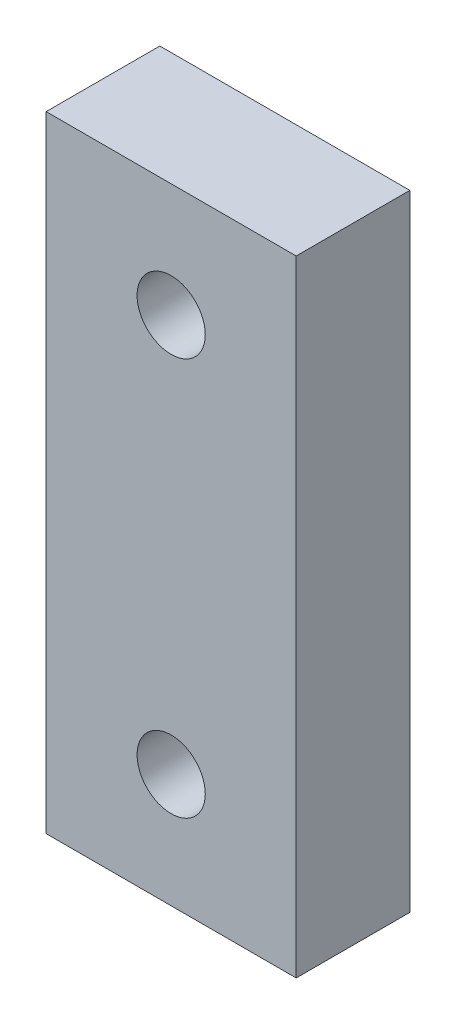
ISO-10303-21;
HEADER;
FILE_DESCRIPTION(('STEP AP214'),'2;1');
FILE_NAME('part.step','',(''),(''),'','','');
FILE_SCHEMA(('AUTOMOTIVE_DESIGN { 1 0 10303 214 1 1 1 1 }'));
ENDSEC;
DATA;
#1=APPLICATION_CONTEXT('core data for automotive mechanical design processes');
#2=APPLICATION_PROTOCOL_DEFINITION('international standard','automotive_design',2000,#1);
#3=PRODUCT_CONTEXT('',#1,'mechanical');
#4=PRODUCT('Part','Part','',(#3));
#5=PRODUCT_RELATED_PRODUCT_CATEGORY('part','',(#4));
#6=PRODUCT_DEFINITION_FORMATION('','',#4);
#7=PRODUCT_DEFINITION_CONTEXT('part definition',#1,'design');
#8=PRODUCT_DEFINITION('design','',#6,#7);
#9=PRODUCT_DEFINITION_SHAPE('','',#8);
#10=(LENGTH_UNIT() NAMED_UNIT(*) SI_UNIT(.MILLI.,.METRE.));
#11=(NAMED_UNIT(*) PLANE_ANGLE_UNIT() SI_UNIT($,.RADIAN.));
#12=(NAMED_UNIT(*) SI_UNIT($,.STERADIAN.) SOLID_ANGLE_UNIT());
#13=UNCERTAINTY_MEASURE_WITH_UNIT(LENGTH_MEASURE(1.E-05),#10,'distance_accuracy_value','');
#14=(GEOMETRIC_REPRESENTATION_CONTEXT(3) GLOBAL_UNCERTAINTY_ASSIGNED_CONTEXT((#13)) GLOBAL_UNIT_ASSIGNED_CONTEXT((#10,
#11,#12)) REPRESENTATION_CONTEXT('',''));
#15=CARTESIAN_POINT('',(0.,0.,0.));
#16=DIRECTION('',(0.,0.,1.));
#17=DIRECTION('',(1.,0.,0.));
#18=AXIS2_PLACEMENT_3D('',#15,#16,#17);
#19=CARTESIAN_POINT('',(5.5,13.755,5.));
#20=DIRECTION('',(-1.,0.,0.));
#21=DIRECTION('',(0.,-1.,0.));
#22=AXIS2_PLACEMENT_3D('',#19,#20,#21);
#23=PLANE('',#22);
#24=DIRECTION('',(0.,1.,0.));
#25=VECTOR('',#24,1.);
#26=CARTESIAN_POINT('',(5.5,13.755,0.));
#27=LINE('',#26,#25);
#28=CARTESIAN_POINT('',(5.5,-13.755,0.));
#29=VERTEX_POINT('',#28);
#30=CARTESIAN_POINT('',(5.5,13.755,0.));
#31=VERTEX_POINT('',#30);
#32=EDGE_CURVE('E100',#29,#31,#27,.T.);
#33=ORIENTED_EDGE('',*,*,#32,.T.);
#34=DIRECTION('',(0.,0.,-1.));
#35=VECTOR('',#34,1.);
#36=CARTESIAN_POINT('',(5.5,13.755,5.));
#37=LINE('',#36,#35);
#38=CARTESIAN_POINT('',(5.5,13.755,5.));
#39=VERTEX_POINT('',#38);
#40=EDGE_CURVE('E11',#39,#31,#37,.T.);
#41=ORIENTED_EDGE('',*,*,#40,.F.);
#42=DIRECTION('',(0.,1.,0.));
#43=VECTOR('',#42,1.);
#44=CARTESIAN_POINT('',(5.5,13.755,5.));
#45=LINE('',#44,#43);
#46=CARTESIAN_POINT('',(5.5,-13.755,5.));
#47=VERTEX_POINT('',#46);
#48=EDGE_CURVE('E88',#47,#39,#45,.T.);
#49=ORIENTED_EDGE('',*,*,#48,.F.);
#50=DIRECTION('',(0.,0.,-1.));
#51=VECTOR('',#50,1.);
#52=CARTESIAN_POINT('',(5.5,-13.755,5.));
#53=LINE('',#52,#51);
#54=EDGE_CURVE('E96',#47,#29,#53,.T.);
#55=ORIENTED_EDGE('',*,*,#54,.T.);
#56=EDGE_LOOP('',(#33,#41,#49,#55));
#57=FACE_BOUND('',#56,.T.);
#58=ADVANCED_FACE('F37',(#57),#23,.F.);
#59=CARTESIAN_POINT('',(-5.5,13.755,5.));
#60=DIRECTION('',(0.,-1.,0.));
#61=DIRECTION('',(0.,0.,-1.));
#62=AXIS2_PLACEMENT_3D('',#59,#60,#61);
#63=PLANE('',#62);
#64=DIRECTION('',(-1.,0.,0.));
#65=VECTOR('',#64,1.);
#66=CARTESIAN_POINT('',(-5.5,13.755,0.));
#67=LINE('',#66,#65);
#68=CARTESIAN_POINT('',(-5.5,13.755,0.));
#69=VERTEX_POINT('',#68);
#70=EDGE_CURVE('E92',#31,#69,#67,.T.);
#71=ORIENTED_EDGE('',*,*,#70,.T.);
#72=DIRECTION('',(0.,0.,-1.));
#73=VECTOR('',#72,1.);
#74=CARTESIAN_POINT('',(-5.5,13.755,5.));
#75=LINE('',#74,#73);
#76=CARTESIAN_POINT('',(-5.5,13.755,5.));
#77=VERTEX_POINT('',#76);
#78=EDGE_CURVE('E45',#77,#69,#75,.T.);
#79=ORIENTED_EDGE('',*,*,#78,.F.);
#80=DIRECTION('',(-1.,0.,0.));
#81=VECTOR('',#80,1.);
#82=CARTESIAN_POINT('',(-5.5,13.755,5.));
#83=LINE('',#82,#81);
#84=EDGE_CURVE('E83',#39,#77,#83,.T.);
#85=ORIENTED_EDGE('',*,*,#84,.F.);
#86=ORIENTED_EDGE('',*,*,#40,.T.);
#87=EDGE_LOOP('',(#71,#79,#85,#86));
#88=FACE_BOUND('',#87,.T.);
#89=ADVANCED_FACE('F91',(#88),#63,.F.);
#90=CARTESIAN_POINT('',(-5.5,13.755,5.));
#91=DIRECTION('',(1.,0.,0.));
#92=DIRECTION('',(0.,1.,0.));
#93=AXIS2_PLACEMENT_3D('',#90,#91,#92);
#94=PLANE('',#93);
#95=DIRECTION('',(0.,-1.,0.));
#96=VECTOR('',#95,1.);
#97=CARTESIAN_POINT('',(-5.5,13.755,0.));
#98=LINE('',#97,#96);
#99=CARTESIAN_POINT('',(-5.5,-13.755,0.));
#100=VERTEX_POINT('',#99);
#101=EDGE_CURVE('E70',#69,#100,#98,.T.);
#102=ORIENTED_EDGE('',*,*,#101,.T.);
#103=DIRECTION('',(0.,0.,-1.));
#104=VECTOR('',#103,1.);
#105=CARTESIAN_POINT('',(-5.5,-13.755,5.));
#106=LINE('',#105,#104);
#107=CARTESIAN_POINT('',(-5.5,-13.755,5.));
#108=VERTEX_POINT('',#107);
#109=EDGE_CURVE('E93',#108,#100,#106,.T.);
#110=ORIENTED_EDGE('',*,*,#109,.F.);
#111=DIRECTION('',(0.,-1.,0.));
#112=VECTOR('',#111,1.);
#113=CARTESIAN_POINT('',(-5.5,13.755,5.));
#114=LINE('',#113,#112);
#115=EDGE_CURVE('E86',#77,#108,#114,.T.);
#116=ORIENTED_EDGE('',*,*,#115,.F.);
#117=ORIENTED_EDGE('',*,*,#78,.T.);
#118=EDGE_LOOP('',(#102,#110,#116,#117));
#119=FACE_BOUND('',#118,.T.);
#120=ADVANCED_FACE('F94',(#119),#94,.F.);
#121=CARTESIAN_POINT('',(-5.5,-13.755,5.));
#122=DIRECTION('',(0.,1.,0.));
#123=DIRECTION('',(0.,0.,1.));
#124=AXIS2_PLACEMENT_3D('',#121,#122,#123);
#125=PLANE('',#124);
#126=DIRECTION('',(1.,0.,0.));
#127=VECTOR('',#126,1.);
#128=CARTESIAN_POINT('',(-5.5,-13.755,0.));
#129=LINE('',#128,#127);
#130=EDGE_CURVE('E76',#100,#29,#129,.T.);
#131=ORIENTED_EDGE('',*,*,#130,.T.);
#132=ORIENTED_EDGE('',*,*,#54,.F.);
#133=DIRECTION('',(1.,0.,0.));
#134=VECTOR('',#133,1.);
#135=CARTESIAN_POINT('',(-5.5,-13.755,5.));
#136=LINE('',#135,#134);
#137=EDGE_CURVE('E53',#108,#47,#136,.T.);
#138=ORIENTED_EDGE('',*,*,#137,.F.);
#139=ORIENTED_EDGE('',*,*,#109,.T.);
#140=EDGE_LOOP('',(#131,#132,#138,#139));
#141=FACE_BOUND('',#140,.T.);
#142=ADVANCED_FACE('F108',(#141),#125,.F.);
#143=CARTESIAN_POINT('',(0.,0.,5.));
#144=DIRECTION('',(0.,0.,1.));
#145=DIRECTION('',(1.,0.,0.));
#146=AXIS2_PLACEMENT_3D('',#143,#144,#145);
#147=PLANE('',#146);
#148=CARTESIAN_POINT('',(0.,8.755,5.));
#149=DIRECTION('',(0.,0.,1.));
#150=DIRECTION('',(1.,0.,0.));
#151=AXIS2_PLACEMENT_3D('',#148,#149,#150);
#152=CIRCLE('',#151,1.5);
#153=CARTESIAN_POINT('',(1.5,8.755,5.));
#154=VERTEX_POINT('',#153);
#155=EDGE_CURVE('E120',#154,#154,#152,.T.);
#156=ORIENTED_EDGE('',*,*,#155,.F.);
#157=EDGE_LOOP('',(#156));
#158=FACE_BOUND('',#157,.T.);
#159=CARTESIAN_POINT('',(0.,-8.745,5.));
#160=DIRECTION('',(0.,0.,1.));
#161=DIRECTION('',(1.,0.,0.));
#162=AXIS2_PLACEMENT_3D('',#159,#160,#161);
#163=CIRCLE('',#162,1.5);
#164=CARTESIAN_POINT('',(1.5,-8.745,5.));
#165=VERTEX_POINT('',#164);
#166=EDGE_CURVE('E114',#165,#165,#163,.T.);
#167=ORIENTED_EDGE('',*,*,#166,.F.);
#168=EDGE_LOOP('',(#167));
#169=FACE_BOUND('',#168,.T.);
#170=ORIENTED_EDGE('',*,*,#48,.T.);
#171=ORIENTED_EDGE('',*,*,#84,.T.);
#172=ORIENTED_EDGE('',*,*,#115,.T.);
#173=ORIENTED_EDGE('',*,*,#137,.T.);
#174=EDGE_LOOP('',(#170,#171,#172,#173));
#175=FACE_BOUND('',#174,.T.);
#176=ADVANCED_FACE('F84',(#158,#169,#175),#147,.T.);
#177=CARTESIAN_POINT('',(0.,0.,0.));
#178=DIRECTION('',(0.,0.,1.));
#179=DIRECTION('',(1.,0.,0.));
#180=AXIS2_PLACEMENT_3D('',#177,#178,#179);
#181=PLANE('',#180);
#182=CARTESIAN_POINT('',(0.,8.755,0.));
#183=DIRECTION('',(0.,0.,1.));
#184=DIRECTION('',(1.,0.,0.));
#185=AXIS2_PLACEMENT_3D('',#182,#183,#184);
#186=CIRCLE('',#185,1.5);
#187=CARTESIAN_POINT('',(1.5,8.755,0.));
#188=VERTEX_POINT('',#187);
#189=EDGE_CURVE('E103',#188,#188,#186,.T.);
#190=ORIENTED_EDGE('',*,*,#189,.T.);
#191=EDGE_LOOP('',(#190));
#192=FACE_BOUND('',#191,.T.);
#193=CARTESIAN_POINT('',(0.,-8.745,0.));
#194=DIRECTION('',(0.,0.,1.));
#195=DIRECTION('',(1.,0.,0.));
#196=AXIS2_PLACEMENT_3D('',#193,#194,#195);
#197=CIRCLE('',#196,1.5);
#198=CARTESIAN_POINT('',(1.5,-8.745,0.));
#199=VERTEX_POINT('',#198);
#200=EDGE_CURVE('E117',#199,#199,#197,.T.);
#201=ORIENTED_EDGE('',*,*,#200,.T.);
#202=EDGE_LOOP('',(#201));
#203=FACE_BOUND('',#202,.T.);
#204=ORIENTED_EDGE('',*,*,#32,.F.);
#205=ORIENTED_EDGE('',*,*,#130,.F.);
#206=ORIENTED_EDGE('',*,*,#101,.F.);
#207=ORIENTED_EDGE('',*,*,#70,.F.);
#208=EDGE_LOOP('',(#204,#205,#206,#207));
#209=FACE_BOUND('',#208,.T.);
#210=ADVANCED_FACE('F111',(#192,#203,#209),#181,.F.);
#211=CARTESIAN_POINT('',(0.,-8.745,0.));
#212=DIRECTION('',(0.,0.,1.));
#213=DIRECTION('',(1.,0.,0.));
#214=AXIS2_PLACEMENT_3D('',#211,#212,#213);
#215=CYLINDRICAL_SURFACE('',#214,1.5);
#216=ORIENTED_EDGE('',*,*,#200,.F.);
#217=EDGE_LOOP('',(#216));
#218=FACE_BOUND('',#217,.T.);
#219=ORIENTED_EDGE('',*,*,#166,.T.);
#220=EDGE_LOOP('',(#219));
#221=FACE_BOUND('',#220,.T.);
#222=ADVANCED_FACE('F131',(#218,#221),#215,.F.);
#223=CARTESIAN_POINT('',(0.,8.755,0.));
#224=DIRECTION('',(0.,0.,1.));
#225=DIRECTION('',(1.,0.,0.));
#226=AXIS2_PLACEMENT_3D('',#223,#224,#225);
#227=CYLINDRICAL_SURFACE('',#226,1.5);
#228=ORIENTED_EDGE('',*,*,#189,.F.);
#229=EDGE_LOOP('',(#228));
#230=FACE_BOUND('',#229,.T.);
#231=ORIENTED_EDGE('',*,*,#155,.T.);
#232=EDGE_LOOP('',(#231));
#233=FACE_BOUND('',#232,.T.);
#234=ADVANCED_FACE('F128',(#230,#233),#227,.F.);
#235=CLOSED_SHELL('',(#58,#89,#120,#142,#176,#210,#222,#234));
#236=MANIFOLD_SOLID_BREP('B2',#235);
#237=ADVANCED_BREP_SHAPE_REPRESENTATION('',(#18,#236),#14);
#238=SHAPE_DEFINITION_REPRESENTATION(#9,#237);
ENDSEC;
END-ISO-10303-21;
